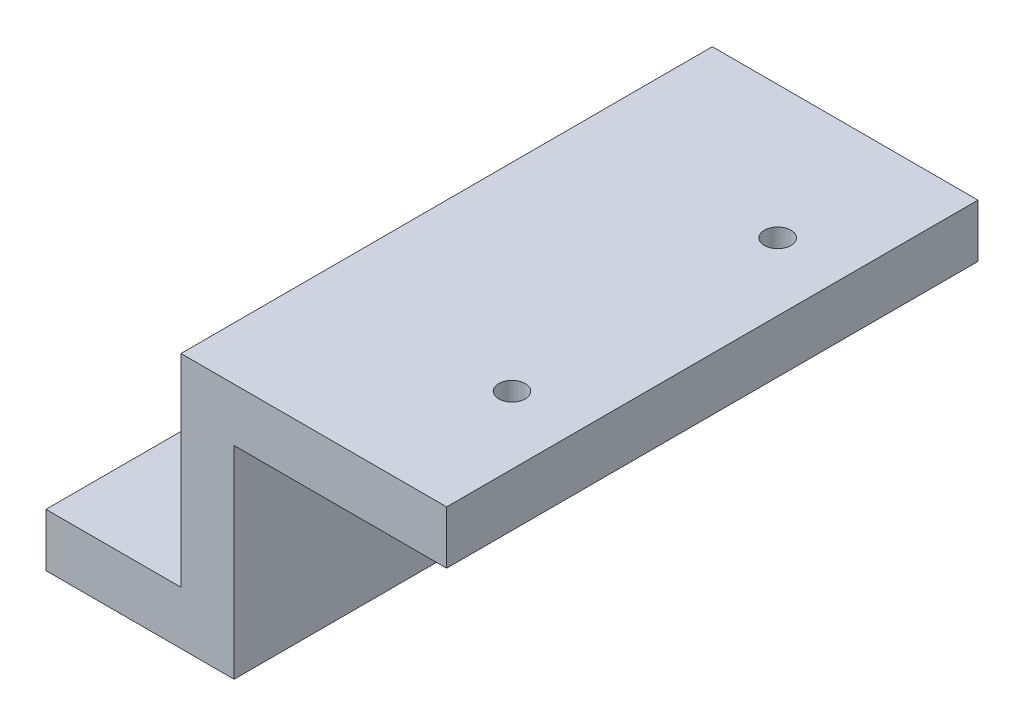
ISO-10303-21;
HEADER;
FILE_DESCRIPTION(('STEP AP214'),'2;1');
FILE_NAME('part.step','',(''),(''),'','','');
FILE_SCHEMA(('AUTOMOTIVE_DESIGN { 1 0 10303 214 1 1 1 1 }'));
ENDSEC;
DATA;
#1=APPLICATION_CONTEXT('core data for automotive mechanical design processes');
#2=APPLICATION_PROTOCOL_DEFINITION('international standard','automotive_design',2000,#1);
#3=PRODUCT_CONTEXT('',#1,'mechanical');
#4=PRODUCT('Part','Part','',(#3));
#5=PRODUCT_RELATED_PRODUCT_CATEGORY('part','',(#4));
#6=PRODUCT_DEFINITION_FORMATION('','',#4);
#7=PRODUCT_DEFINITION_CONTEXT('part definition',#1,'design');
#8=PRODUCT_DEFINITION('design','',#6,#7);
#9=PRODUCT_DEFINITION_SHAPE('','',#8);
#10=(LENGTH_UNIT() NAMED_UNIT(*) SI_UNIT(.MILLI.,.METRE.));
#11=(NAMED_UNIT(*) PLANE_ANGLE_UNIT() SI_UNIT($,.RADIAN.));
#12=(NAMED_UNIT(*) SI_UNIT($,.STERADIAN.) SOLID_ANGLE_UNIT());
#13=UNCERTAINTY_MEASURE_WITH_UNIT(LENGTH_MEASURE(1.E-05),#10,'distance_accuracy_value','');
#14=(GEOMETRIC_REPRESENTATION_CONTEXT(3) GLOBAL_UNCERTAINTY_ASSIGNED_CONTEXT((#13)) GLOBAL_UNIT_ASSIGNED_CONTEXT((#10,
#11,#12)) REPRESENTATION_CONTEXT('',''));
#15=CARTESIAN_POINT('',(0.,0.,0.));
#16=DIRECTION('',(0.,0.,1.));
#17=DIRECTION('',(1.,0.,0.));
#18=AXIS2_PLACEMENT_3D('',#15,#16,#17);
#19=CARTESIAN_POINT('',(-15.,-43.1,100.));
#20=DIRECTION('',(-1.,0.,0.));
#21=DIRECTION('',(0.,0.,1.));
#22=AXIS2_PLACEMENT_3D('',#19,#20,#21);
#23=PLANE('',#22);
#24=CARTESIAN_POINT('',(-15.,-26.1,73.));
#25=DIRECTION('',(1.,0.,0.));
#26=DIRECTION('',(0.,0.,-1.));
#27=AXIS2_PLACEMENT_3D('',#24,#25,#26);
#28=CIRCLE('',#27,2.49999999999999);
#29=CARTESIAN_POINT('',(-15.,-26.1,70.5));
#30=VERTEX_POINT('',#29);
#31=EDGE_CURVE('E288',#30,#30,#28,.T.);
#32=ORIENTED_EDGE('',*,*,#31,.F.);
#33=EDGE_LOOP('',(#32));
#34=FACE_BOUND('',#33,.T.);
#35=CARTESIAN_POINT('',(-15.,-26.1,27.));
#36=DIRECTION('',(1.,0.,0.));
#37=DIRECTION('',(0.,0.,-1.));
#38=AXIS2_PLACEMENT_3D('',#35,#36,#37);
#39=CIRCLE('',#38,2.49999999999999);
#40=CARTESIAN_POINT('',(-15.,-26.1,24.5));
#41=VERTEX_POINT('',#40);
#42=EDGE_CURVE('E292',#41,#41,#39,.T.);
#43=ORIENTED_EDGE('',*,*,#42,.F.);
#44=EDGE_LOOP('',(#43));
#45=FACE_BOUND('',#44,.T.);
#46=CARTESIAN_POINT('',(-15.,-8.09999999999999,73.));
#47=DIRECTION('',(1.,0.,0.));
#48=DIRECTION('',(0.,0.,-1.));
#49=AXIS2_PLACEMENT_3D('',#46,#47,#48);
#50=CIRCLE('',#49,2.49999999999999);
#51=CARTESIAN_POINT('',(-15.,-8.09999999999999,70.5));
#52=VERTEX_POINT('',#51);
#53=EDGE_CURVE('E303',#52,#52,#50,.T.);
#54=ORIENTED_EDGE('',*,*,#53,.F.);
#55=EDGE_LOOP('',(#54));
#56=FACE_BOUND('',#55,.T.);
#57=DIRECTION('',(0.,0.,1.));
#58=VECTOR('',#57,1.);
#59=CARTESIAN_POINT('',(-15.,-5.,100.));
#60=LINE('',#59,#58);
#61=CARTESIAN_POINT('',(-15.,-5.,0.));
#62=VERTEX_POINT('',#61);
#63=CARTESIAN_POINT('',(-15.,-5.,100.));
#64=VERTEX_POINT('',#63);
#65=EDGE_CURVE('E72',#62,#64,#60,.T.);
#66=ORIENTED_EDGE('',*,*,#65,.T.);
#67=DIRECTION('',(0.,1.,0.));
#68=VECTOR('',#67,1.);
#69=CARTESIAN_POINT('',(-15.,-43.1,100.));
#70=LINE('',#69,#68);
#71=CARTESIAN_POINT('',(-15.,-43.1,100.));
#72=VERTEX_POINT('',#71);
#73=EDGE_CURVE('E166',#72,#64,#70,.T.);
#74=ORIENTED_EDGE('',*,*,#73,.F.);
#75=DIRECTION('',(0.,0.,1.));
#76=VECTOR('',#75,1.);
#77=CARTESIAN_POINT('',(-15.,-43.1,100.));
#78=LINE('',#77,#76);
#79=CARTESIAN_POINT('',(-15.,-43.1,0.));
#80=VERTEX_POINT('',#79);
#81=EDGE_CURVE('E127',#80,#72,#78,.T.);
#82=ORIENTED_EDGE('',*,*,#81,.F.);
#83=DIRECTION('',(0.,1.,0.));
#84=VECTOR('',#83,1.);
#85=CARTESIAN_POINT('',(-15.,-43.1,0.));
#86=LINE('',#85,#84);
#87=EDGE_CURVE('E123',#80,#62,#86,.T.);
#88=ORIENTED_EDGE('',*,*,#87,.T.);
#89=EDGE_LOOP('',(#66,#74,#82,#88));
#90=FACE_BOUND('',#89,.T.);
#91=CARTESIAN_POINT('',(-15.,-8.09999999999999,27.));
#92=DIRECTION('',(1.,0.,0.));
#93=DIRECTION('',(0.,0.,-1.));
#94=AXIS2_PLACEMENT_3D('',#91,#92,#93);
#95=CIRCLE('',#94,2.49999999999999);
#96=CARTESIAN_POINT('',(-15.,-8.09999999999999,24.5));
#97=VERTEX_POINT('',#96);
#98=EDGE_CURVE('E311',#97,#97,#95,.T.);
#99=ORIENTED_EDGE('',*,*,#98,.F.);
#100=EDGE_LOOP('',(#99));
#101=FACE_BOUND('',#100,.T.);
#102=ADVANCED_FACE('F47',(#34,#45,#56,#90,#101),#23,.F.);
#103=CARTESIAN_POINT('',(-25.,-5.,100.));
#104=DIRECTION('',(1.,0.,0.));
#105=DIRECTION('',(0.,0.,-1.));
#106=AXIS2_PLACEMENT_3D('',#103,#104,#105);
#107=PLANE('',#106);
#108=CARTESIAN_POINT('',(-25.,-26.1,73.));
#109=DIRECTION('',(1.,0.,0.));
#110=DIRECTION('',(0.,0.,-1.));
#111=AXIS2_PLACEMENT_3D('',#108,#109,#110);
#112=CIRCLE('',#111,2.49999999999999);
#113=CARTESIAN_POINT('',(-25.,-26.1,70.5));
#114=VERTEX_POINT('',#113);
#115=EDGE_CURVE('E51',#114,#114,#112,.T.);
#116=ORIENTED_EDGE('',*,*,#115,.T.);
#117=EDGE_LOOP('',(#116));
#118=FACE_BOUND('',#117,.T.);
#119=CARTESIAN_POINT('',(-25.,-26.1,27.));
#120=DIRECTION('',(1.,0.,0.));
#121=DIRECTION('',(0.,0.,-1.));
#122=AXIS2_PLACEMENT_3D('',#119,#120,#121);
#123=CIRCLE('',#122,2.49999999999999);
#124=CARTESIAN_POINT('',(-25.,-26.1,24.5));
#125=VERTEX_POINT('',#124);
#126=EDGE_CURVE('E296',#125,#125,#123,.T.);
#127=ORIENTED_EDGE('',*,*,#126,.T.);
#128=EDGE_LOOP('',(#127));
#129=FACE_BOUND('',#128,.T.);
#130=CARTESIAN_POINT('',(-25.,-8.09999999999999,73.));
#131=DIRECTION('',(1.,0.,0.));
#132=DIRECTION('',(0.,0.,-1.));
#133=AXIS2_PLACEMENT_3D('',#130,#131,#132);
#134=CIRCLE('',#133,2.49999999999999);
#135=CARTESIAN_POINT('',(-25.,-8.09999999999999,70.5));
#136=VERTEX_POINT('',#135);
#137=EDGE_CURVE('E307',#136,#136,#134,.T.);
#138=ORIENTED_EDGE('',*,*,#137,.T.);
#139=EDGE_LOOP('',(#138));
#140=FACE_BOUND('',#139,.T.);
#141=CARTESIAN_POINT('',(-25.,-8.09999999999999,27.));
#142=DIRECTION('',(1.,0.,0.));
#143=DIRECTION('',(0.,0.,-1.));
#144=AXIS2_PLACEMENT_3D('',#141,#142,#143);
#145=CIRCLE('',#144,2.49999999999999);
#146=CARTESIAN_POINT('',(-25.,-8.09999999999999,24.5));
#147=VERTEX_POINT('',#146);
#148=EDGE_CURVE('E315',#147,#147,#145,.T.);
#149=ORIENTED_EDGE('',*,*,#148,.T.);
#150=EDGE_LOOP('',(#149));
#151=FACE_BOUND('',#150,.T.);
#152=DIRECTION('',(0.,0.,-1.));
#153=VECTOR('',#152,1.);
#154=CARTESIAN_POINT('',(-25.,-33.1,0.));
#155=LINE('',#154,#153);
#156=CARTESIAN_POINT('',(-25.,-33.1,100.));
#157=VERTEX_POINT('',#156);
#158=CARTESIAN_POINT('',(-25.,-33.1,0.));
#159=VERTEX_POINT('',#158);
#160=EDGE_CURVE('E64',#157,#159,#155,.T.);
#161=ORIENTED_EDGE('',*,*,#160,.F.);
#162=DIRECTION('',(0.,-1.,0.));
#163=VECTOR('',#162,1.);
#164=CARTESIAN_POINT('',(-25.,-5.,100.));
#165=LINE('',#164,#163);
#166=CARTESIAN_POINT('',(-25.,5.,100.));
#167=VERTEX_POINT('',#166);
#168=EDGE_CURVE('E183',#167,#157,#165,.T.);
#169=ORIENTED_EDGE('',*,*,#168,.F.);
#170=DIRECTION('',(0.,0.,-1.));
#171=VECTOR('',#170,1.);
#172=CARTESIAN_POINT('',(-25.,5.,100.));
#173=LINE('',#172,#171);
#174=CARTESIAN_POINT('',(-25.,5.,0.));
#175=VERTEX_POINT('',#174);
#176=EDGE_CURVE('E57',#167,#175,#173,.T.);
#177=ORIENTED_EDGE('',*,*,#176,.T.);
#178=DIRECTION('',(0.,-1.,0.));
#179=VECTOR('',#178,1.);
#180=CARTESIAN_POINT('',(-25.,-5.,0.));
#181=LINE('',#180,#179);
#182=EDGE_CURVE('E196',#175,#159,#181,.T.);
#183=ORIENTED_EDGE('',*,*,#182,.T.);
#184=EDGE_LOOP('',(#161,#169,#177,#183));
#185=FACE_BOUND('',#184,.T.);
#186=ADVANCED_FACE('F208',(#118,#129,#140,#151,#185),#107,.F.);
#187=CARTESIAN_POINT('',(-25.,-5.,100.));
#188=DIRECTION('',(0.,1.,0.));
#189=DIRECTION('',(0.,0.,1.));
#190=AXIS2_PLACEMENT_3D('',#187,#188,#189);
#191=PLANE('',#190);
#192=CARTESIAN_POINT('',(12.3,-5.,25.));
#193=DIRECTION('',(0.,1.,0.));
#194=DIRECTION('',(0.,0.,1.));
#195=AXIS2_PLACEMENT_3D('',#192,#193,#194);
#196=CIRCLE('',#195,2.49999999999999);
#197=CARTESIAN_POINT('',(12.3,-5.,27.5));
#198=VERTEX_POINT('',#197);
#199=EDGE_CURVE('E323',#198,#198,#196,.T.);
#200=ORIENTED_EDGE('',*,*,#199,.T.);
#201=EDGE_LOOP('',(#200));
#202=FACE_BOUND('',#201,.T.);
#203=CARTESIAN_POINT('',(12.3,-5.,75.));
#204=DIRECTION('',(0.,1.,0.));
#205=DIRECTION('',(0.,0.,1.));
#206=AXIS2_PLACEMENT_3D('',#203,#204,#205);
#207=CIRCLE('',#206,2.49999999999999);
#208=CARTESIAN_POINT('',(12.3,-5.,77.5));
#209=VERTEX_POINT('',#208);
#210=EDGE_CURVE('E146',#209,#209,#207,.T.);
#211=ORIENTED_EDGE('',*,*,#210,.T.);
#212=EDGE_LOOP('',(#211));
#213=FACE_BOUND('',#212,.T.);
#214=ORIENTED_EDGE('',*,*,#65,.F.);
#215=DIRECTION('',(1.,0.,0.));
#216=VECTOR('',#215,1.);
#217=CARTESIAN_POINT('',(-25.,-5.,0.));
#218=LINE('',#217,#216);
#219=CARTESIAN_POINT('',(25.,-5.,0.));
#220=VERTEX_POINT('',#219);
#221=EDGE_CURVE('E180',#62,#220,#218,.T.);
#222=ORIENTED_EDGE('',*,*,#221,.T.);
#223=DIRECTION('',(0.,0.,-1.));
#224=VECTOR('',#223,1.);
#225=CARTESIAN_POINT('',(25.,-5.,100.));
#226=LINE('',#225,#224);
#227=CARTESIAN_POINT('',(25.,-5.,100.));
#228=VERTEX_POINT('',#227);
#229=EDGE_CURVE('E189',#228,#220,#226,.T.);
#230=ORIENTED_EDGE('',*,*,#229,.F.);
#231=DIRECTION('',(1.,0.,0.));
#232=VECTOR('',#231,1.);
#233=CARTESIAN_POINT('',(-25.,-5.,100.));
#234=LINE('',#233,#232);
#235=EDGE_CURVE('E186',#64,#228,#234,.T.);
#236=ORIENTED_EDGE('',*,*,#235,.F.);
#237=EDGE_LOOP('',(#214,#222,#230,#236));
#238=FACE_BOUND('',#237,.T.);
#239=ADVANCED_FACE('F223',(#202,#213,#238),#191,.F.);
#240=CARTESIAN_POINT('',(25.,-5.,100.));
#241=DIRECTION('',(-1.,0.,0.));
#242=DIRECTION('',(0.,0.,1.));
#243=AXIS2_PLACEMENT_3D('',#240,#241,#242);
#244=PLANE('',#243);
#245=DIRECTION('',(0.,1.,0.));
#246=VECTOR('',#245,1.);
#247=CARTESIAN_POINT('',(25.,-5.,0.));
#248=LINE('',#247,#246);
#249=CARTESIAN_POINT('',(25.,5.,0.));
#250=VERTEX_POINT('',#249);
#251=EDGE_CURVE('E174',#220,#250,#248,.T.);
#252=ORIENTED_EDGE('',*,*,#251,.T.);
#253=DIRECTION('',(0.,0.,-1.));
#254=VECTOR('',#253,1.);
#255=CARTESIAN_POINT('',(25.,5.,100.));
#256=LINE('',#255,#254);
#257=CARTESIAN_POINT('',(25.,5.,100.));
#258=VERTEX_POINT('',#257);
#259=EDGE_CURVE('E11',#258,#250,#256,.T.);
#260=ORIENTED_EDGE('',*,*,#259,.F.);
#261=DIRECTION('',(0.,1.,0.));
#262=VECTOR('',#261,1.);
#263=CARTESIAN_POINT('',(25.,-5.,100.));
#264=LINE('',#263,#262);
#265=EDGE_CURVE('E175',#228,#258,#264,.T.);
#266=ORIENTED_EDGE('',*,*,#265,.F.);
#267=ORIENTED_EDGE('',*,*,#229,.T.);
#268=EDGE_LOOP('',(#252,#260,#266,#267));
#269=FACE_BOUND('',#268,.T.);
#270=ADVANCED_FACE('F49',(#269),#244,.F.);
#271=CARTESIAN_POINT('',(-25.,5.,100.));
#272=DIRECTION('',(0.,-1.,0.));
#273=DIRECTION('',(0.,0.,-1.));
#274=AXIS2_PLACEMENT_3D('',#271,#272,#273);
#275=PLANE('',#274);
#276=CARTESIAN_POINT('',(12.3,5.,25.));
#277=DIRECTION('',(0.,1.,0.));
#278=DIRECTION('',(0.,0.,1.));
#279=AXIS2_PLACEMENT_3D('',#276,#277,#278);
#280=CIRCLE('',#279,2.49999999999999);
#281=CARTESIAN_POINT('',(12.3,5.,27.5));
#282=VERTEX_POINT('',#281);
#283=EDGE_CURVE('E319',#282,#282,#280,.T.);
#284=ORIENTED_EDGE('',*,*,#283,.F.);
#285=EDGE_LOOP('',(#284));
#286=FACE_BOUND('',#285,.T.);
#287=CARTESIAN_POINT('',(12.3,5.,75.));
#288=DIRECTION('',(0.,1.,0.));
#289=DIRECTION('',(0.,0.,1.));
#290=AXIS2_PLACEMENT_3D('',#287,#288,#289);
#291=CIRCLE('',#290,2.49999999999999);
#292=CARTESIAN_POINT('',(12.3,5.,77.5));
#293=VERTEX_POINT('',#292);
#294=EDGE_CURVE('E325',#293,#293,#291,.T.);
#295=ORIENTED_EDGE('',*,*,#294,.F.);
#296=EDGE_LOOP('',(#295));
#297=FACE_BOUND('',#296,.T.);
#298=DIRECTION('',(-1.,0.,0.));
#299=VECTOR('',#298,1.);
#300=CARTESIAN_POINT('',(-25.,5.,0.));
#301=LINE('',#300,#299);
#302=EDGE_CURVE('E193',#250,#175,#301,.T.);
#303=ORIENTED_EDGE('',*,*,#302,.T.);
#304=ORIENTED_EDGE('',*,*,#176,.F.);
#305=DIRECTION('',(-1.,0.,0.));
#306=VECTOR('',#305,1.);
#307=CARTESIAN_POINT('',(-25.,5.,100.));
#308=LINE('',#307,#306);
#309=EDGE_CURVE('E179',#258,#167,#308,.T.);
#310=ORIENTED_EDGE('',*,*,#309,.F.);
#311=ORIENTED_EDGE('',*,*,#259,.T.);
#312=EDGE_LOOP('',(#303,#304,#310,#311));
#313=FACE_BOUND('',#312,.T.);
#314=ADVANCED_FACE('F217',(#286,#297,#313),#275,.F.);
#315=CARTESIAN_POINT('',(0.,0.,100.));
#316=DIRECTION('',(0.,0.,-1.));
#317=DIRECTION('',(-1.,0.,0.));
#318=AXIS2_PLACEMENT_3D('',#315,#316,#317);
#319=PLANE('',#318);
#320=ORIENTED_EDGE('',*,*,#265,.T.);
#321=ORIENTED_EDGE('',*,*,#309,.T.);
#322=ORIENTED_EDGE('',*,*,#168,.T.);
#323=DIRECTION('',(1.,0.,0.));
#324=VECTOR('',#323,1.);
#325=CARTESIAN_POINT('',(-50.4,-33.1,100.));
#326=LINE('',#325,#324);
#327=CARTESIAN_POINT('',(-50.4,-33.1,100.));
#328=VERTEX_POINT('',#327);
#329=EDGE_CURVE('E158',#328,#157,#326,.T.);
#330=ORIENTED_EDGE('',*,*,#329,.F.);
#331=DIRECTION('',(0.,1.,0.));
#332=VECTOR('',#331,1.);
#333=CARTESIAN_POINT('',(-50.4,-43.1,100.));
#334=LINE('',#333,#332);
#335=CARTESIAN_POINT('',(-50.4,-43.1,100.));
#336=VERTEX_POINT('',#335);
#337=EDGE_CURVE('E137',#336,#328,#334,.T.);
#338=ORIENTED_EDGE('',*,*,#337,.F.);
#339=DIRECTION('',(-1.,0.,0.));
#340=VECTOR('',#339,1.);
#341=CARTESIAN_POINT('',(-25.,-43.1,100.));
#342=LINE('',#341,#340);
#343=EDGE_CURVE('E133',#72,#336,#342,.T.);
#344=ORIENTED_EDGE('',*,*,#343,.F.);
#345=ORIENTED_EDGE('',*,*,#73,.T.);
#346=ORIENTED_EDGE('',*,*,#235,.T.);
#347=EDGE_LOOP('',(#320,#321,#322,#330,#338,#344,#345,#346));
#348=FACE_BOUND('',#347,.T.);
#349=ADVANCED_FACE('F214',(#348),#319,.F.);
#350=CARTESIAN_POINT('',(0.,0.,0.));
#351=DIRECTION('',(0.,0.,-1.));
#352=DIRECTION('',(-1.,0.,0.));
#353=AXIS2_PLACEMENT_3D('',#350,#351,#352);
#354=PLANE('',#353);
#355=ORIENTED_EDGE('',*,*,#251,.F.);
#356=ORIENTED_EDGE('',*,*,#221,.F.);
#357=ORIENTED_EDGE('',*,*,#87,.F.);
#358=DIRECTION('',(1.,0.,0.));
#359=VECTOR('',#358,1.);
#360=CARTESIAN_POINT('',(-25.,-43.1,0.));
#361=LINE('',#360,#359);
#362=CARTESIAN_POINT('',(-50.4,-43.1,0.));
#363=VERTEX_POINT('',#362);
#364=EDGE_CURVE('E115',#363,#80,#361,.T.);
#365=ORIENTED_EDGE('',*,*,#364,.F.);
#366=DIRECTION('',(0.,-1.,0.));
#367=VECTOR('',#366,1.);
#368=CARTESIAN_POINT('',(-50.4,-43.1,0.));
#369=LINE('',#368,#367);
#370=CARTESIAN_POINT('',(-50.4,-33.1,0.));
#371=VERTEX_POINT('',#370);
#372=EDGE_CURVE('E121',#371,#363,#369,.T.);
#373=ORIENTED_EDGE('',*,*,#372,.F.);
#374=DIRECTION('',(1.,0.,0.));
#375=VECTOR('',#374,1.);
#376=CARTESIAN_POINT('',(-50.4,-33.1,0.));
#377=LINE('',#376,#375);
#378=EDGE_CURVE('E154',#371,#159,#377,.T.);
#379=ORIENTED_EDGE('',*,*,#378,.T.);
#380=ORIENTED_EDGE('',*,*,#182,.F.);
#381=ORIENTED_EDGE('',*,*,#302,.F.);
#382=EDGE_LOOP('',(#355,#356,#357,#365,#373,#379,#380,#381));
#383=FACE_BOUND('',#382,.T.);
#384=ADVANCED_FACE('F118',(#383),#354,.T.);
#385=CARTESIAN_POINT('',(0.,-43.1,0.));
#386=DIRECTION('',(0.,-1.,0.));
#387=DIRECTION('',(0.,0.,-1.));
#388=AXIS2_PLACEMENT_3D('',#385,#386,#387);
#389=PLANE('',#388);
#390=ORIENTED_EDGE('',*,*,#343,.T.);
#391=DIRECTION('',(0.,0.,1.));
#392=VECTOR('',#391,1.);
#393=CARTESIAN_POINT('',(-50.4,-43.1,0.));
#394=LINE('',#393,#392);
#395=EDGE_CURVE('E130',#363,#336,#394,.T.);
#396=ORIENTED_EDGE('',*,*,#395,.F.);
#397=ORIENTED_EDGE('',*,*,#364,.T.);
#398=ORIENTED_EDGE('',*,*,#81,.T.);
#399=EDGE_LOOP('',(#390,#396,#397,#398));
#400=FACE_BOUND('',#399,.T.);
#401=ADVANCED_FACE('F131',(#400),#389,.T.);
#402=CARTESIAN_POINT('',(-50.4,-33.1,0.));
#403=DIRECTION('',(0.,-1.,0.));
#404=DIRECTION('',(0.,0.,-1.));
#405=AXIS2_PLACEMENT_3D('',#402,#403,#404);
#406=PLANE('',#405);
#407=ORIENTED_EDGE('',*,*,#160,.T.);
#408=ORIENTED_EDGE('',*,*,#378,.F.);
#409=DIRECTION('',(0.,0.,-1.));
#410=VECTOR('',#409,1.);
#411=CARTESIAN_POINT('',(-50.4,-33.1,0.));
#412=LINE('',#411,#410);
#413=EDGE_CURVE('E141',#328,#371,#412,.T.);
#414=ORIENTED_EDGE('',*,*,#413,.F.);
#415=ORIENTED_EDGE('',*,*,#329,.T.);
#416=EDGE_LOOP('',(#407,#408,#414,#415));
#417=FACE_BOUND('',#416,.T.);
#418=ADVANCED_FACE('F211',(#417),#406,.F.);
#419=CARTESIAN_POINT('',(-50.4,0.,0.));
#420=DIRECTION('',(1.,0.,0.));
#421=DIRECTION('',(0.,0.,-1.));
#422=AXIS2_PLACEMENT_3D('',#419,#420,#421);
#423=PLANE('',#422);
#424=ORIENTED_EDGE('',*,*,#372,.T.);
#425=ORIENTED_EDGE('',*,*,#395,.T.);
#426=ORIENTED_EDGE('',*,*,#337,.T.);
#427=ORIENTED_EDGE('',*,*,#413,.T.);
#428=EDGE_LOOP('',(#424,#425,#426,#427));
#429=FACE_BOUND('',#428,.T.);
#430=ADVANCED_FACE('F139',(#429),#423,.F.);
#431=CARTESIAN_POINT('',(12.3,5.,75.));
#432=DIRECTION('',(0.,1.,0.));
#433=DIRECTION('',(0.,0.,1.));
#434=AXIS2_PLACEMENT_3D('',#431,#432,#433);
#435=CYLINDRICAL_SURFACE('',#434,2.49999999999999);
#436=ORIENTED_EDGE('',*,*,#294,.T.);
#437=EDGE_LOOP('',(#436));
#438=FACE_BOUND('',#437,.T.);
#439=ORIENTED_EDGE('',*,*,#210,.F.);
#440=EDGE_LOOP('',(#439));
#441=FACE_BOUND('',#440,.T.);
#442=ADVANCED_FACE('F259',(#438,#441),#435,.F.);
#443=CARTESIAN_POINT('',(12.3,5.,25.));
#444=DIRECTION('',(0.,1.,0.));
#445=DIRECTION('',(0.,0.,1.));
#446=AXIS2_PLACEMENT_3D('',#443,#444,#445);
#447=CYLINDRICAL_SURFACE('',#446,2.49999999999999);
#448=ORIENTED_EDGE('',*,*,#283,.T.);
#449=EDGE_LOOP('',(#448));
#450=FACE_BOUND('',#449,.T.);
#451=ORIENTED_EDGE('',*,*,#199,.F.);
#452=EDGE_LOOP('',(#451));
#453=FACE_BOUND('',#452,.T.);
#454=ADVANCED_FACE('F264',(#450,#453),#447,.F.);
#455=CARTESIAN_POINT('',(-15.,-8.09999999999999,27.));
#456=DIRECTION('',(1.,0.,0.));
#457=DIRECTION('',(0.,0.,-1.));
#458=AXIS2_PLACEMENT_3D('',#455,#456,#457);
#459=CYLINDRICAL_SURFACE('',#458,2.49999999999999);
#460=ORIENTED_EDGE('',*,*,#98,.T.);
#461=EDGE_LOOP('',(#460));
#462=FACE_BOUND('',#461,.T.);
#463=ORIENTED_EDGE('',*,*,#148,.F.);
#464=EDGE_LOOP('',(#463));
#465=FACE_BOUND('',#464,.T.);
#466=ADVANCED_FACE('F268',(#462,#465),#459,.F.);
#467=CARTESIAN_POINT('',(-15.,-8.09999999999999,73.));
#468=DIRECTION('',(1.,0.,0.));
#469=DIRECTION('',(0.,0.,-1.));
#470=AXIS2_PLACEMENT_3D('',#467,#468,#469);
#471=CYLINDRICAL_SURFACE('',#470,2.49999999999999);
#472=ORIENTED_EDGE('',*,*,#53,.T.);
#473=EDGE_LOOP('',(#472));
#474=FACE_BOUND('',#473,.T.);
#475=ORIENTED_EDGE('',*,*,#137,.F.);
#476=EDGE_LOOP('',(#475));
#477=FACE_BOUND('',#476,.T.);
#478=ADVANCED_FACE('F272',(#474,#477),#471,.F.);
#479=CARTESIAN_POINT('',(-15.,-26.1,27.));
#480=DIRECTION('',(1.,0.,0.));
#481=DIRECTION('',(0.,0.,-1.));
#482=AXIS2_PLACEMENT_3D('',#479,#480,#481);
#483=CYLINDRICAL_SURFACE('',#482,2.49999999999999);
#484=ORIENTED_EDGE('',*,*,#42,.T.);
#485=EDGE_LOOP('',(#484));
#486=FACE_BOUND('',#485,.T.);
#487=ORIENTED_EDGE('',*,*,#126,.F.);
#488=EDGE_LOOP('',(#487));
#489=FACE_BOUND('',#488,.T.);
#490=ADVANCED_FACE('F276',(#486,#489),#483,.F.);
#491=CARTESIAN_POINT('',(-15.,-26.1,73.));
#492=DIRECTION('',(1.,0.,0.));
#493=DIRECTION('',(0.,0.,-1.));
#494=AXIS2_PLACEMENT_3D('',#491,#492,#493);
#495=CYLINDRICAL_SURFACE('',#494,2.49999999999999);
#496=ORIENTED_EDGE('',*,*,#31,.T.);
#497=EDGE_LOOP('',(#496));
#498=FACE_BOUND('',#497,.T.);
#499=ORIENTED_EDGE('',*,*,#115,.F.);
#500=EDGE_LOOP('',(#499));
#501=FACE_BOUND('',#500,.T.);
#502=ADVANCED_FACE('F280',(#498,#501),#495,.F.);
#503=CLOSED_SHELL('',(#102,#186,#239,#270,#314,#349,#384,#401,#418,#430,#442,#454,#466,#478,
#490,#502));
#504=MANIFOLD_SOLID_BREP('B2',#503);
#505=ADVANCED_BREP_SHAPE_REPRESENTATION('',(#18,#504),#14);
#506=SHAPE_DEFINITION_REPRESENTATION(#9,#505);
ENDSEC;
END-ISO-10303-21;
